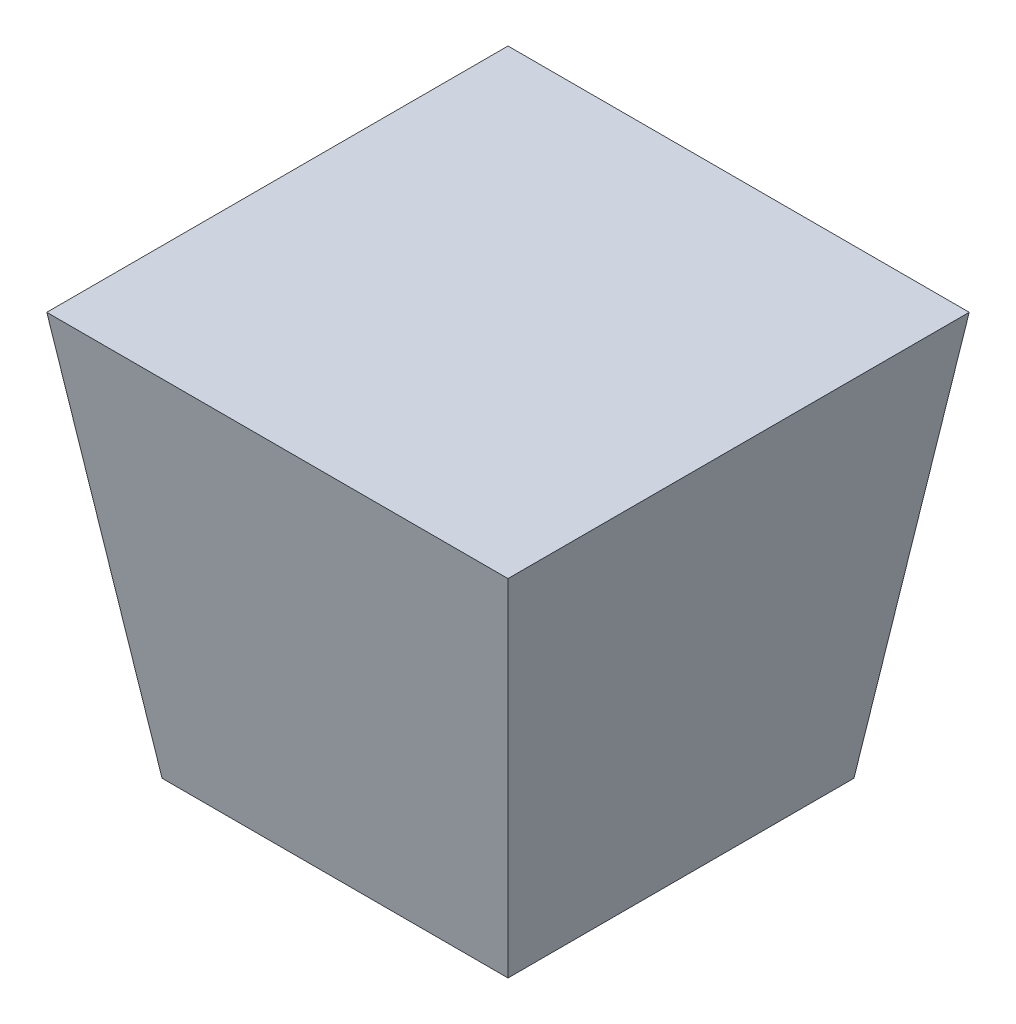
ISO-10303-21;
HEADER;
FILE_DESCRIPTION(('STEP AP214'),'2;1');
FILE_NAME('part.step','',(''),(''),'','','');
FILE_SCHEMA(('AUTOMOTIVE_DESIGN { 1 0 10303 214 1 1 1 1 }'));
ENDSEC;
DATA;
#1=APPLICATION_CONTEXT('core data for automotive mechanical design processes');
#2=APPLICATION_PROTOCOL_DEFINITION('international standard','automotive_design',2000,#1);
#3=PRODUCT_CONTEXT('',#1,'mechanical');
#4=PRODUCT('Part','Part','',(#3));
#5=PRODUCT_RELATED_PRODUCT_CATEGORY('part','',(#4));
#6=PRODUCT_DEFINITION_FORMATION('','',#4);
#7=PRODUCT_DEFINITION_CONTEXT('part definition',#1,'design');
#8=PRODUCT_DEFINITION('design','',#6,#7);
#9=PRODUCT_DEFINITION_SHAPE('','',#8);
#10=(LENGTH_UNIT() NAMED_UNIT(*) SI_UNIT(.MILLI.,.METRE.));
#11=(NAMED_UNIT(*) PLANE_ANGLE_UNIT() SI_UNIT($,.RADIAN.));
#12=(NAMED_UNIT(*) SI_UNIT($,.STERADIAN.) SOLID_ANGLE_UNIT());
#13=UNCERTAINTY_MEASURE_WITH_UNIT(LENGTH_MEASURE(1.E-05),#10,'distance_accuracy_value','');
#14=(GEOMETRIC_REPRESENTATION_CONTEXT(3) GLOBAL_UNCERTAINTY_ASSIGNED_CONTEXT((#13)) GLOBAL_UNIT_ASSIGNED_CONTEXT((#10,
#11,#12)) REPRESENTATION_CONTEXT('',''));
#15=CARTESIAN_POINT('',(0.,0.,0.));
#16=DIRECTION('',(0.,0.,1.));
#17=DIRECTION('',(1.,0.,0.));
#18=AXIS2_PLACEMENT_3D('',#15,#16,#17);
#19=CARTESIAN_POINT('',(-50.8077994428969,40.,-15.5431754874652));
#20=DIRECTION('',(1.,0.,0.));
#21=DIRECTION('',(0.,0.,-1.));
#22=AXIS2_PLACEMENT_3D('',#19,#20,#21);
#23=PLANE('',#22);
#24=DIRECTION('',(0.,0.,1.));
#25=VECTOR('',#24,1.);
#26=CARTESIAN_POINT('',(-50.8077994428969,0.,-15.5431754874652));
#27=LINE('',#26,#25);
#28=CARTESIAN_POINT('',(-50.8077994428969,0.,-15.5431754874652));
#29=VERTEX_POINT('',#28);
#30=CARTESIAN_POINT('',(-50.8077994428969,0.,14.4568245125348));
#31=VERTEX_POINT('',#30);
#32=EDGE_CURVE('E94',#29,#31,#27,.T.);
#33=ORIENTED_EDGE('',*,*,#32,.T.);
#34=DIRECTION('',(0.,-0.970142500145332,-0.242535625036333));
#35=VECTOR('',#34,1.);
#36=CARTESIAN_POINT('',(-50.8077994428969,0.,14.4568245125348));
#37=LINE('',#36,#35);
#38=CARTESIAN_POINT('',(-50.8077994428969,40.,24.4568245125348));
#39=VERTEX_POINT('',#38);
#40=EDGE_CURVE('E105',#39,#31,#37,.T.);
#41=ORIENTED_EDGE('',*,*,#40,.F.);
#42=DIRECTION('',(0.,0.,1.));
#43=VECTOR('',#42,1.);
#44=CARTESIAN_POINT('',(-50.8077994428969,40.,-15.5431754874652));
#45=LINE('',#44,#43);
#46=CARTESIAN_POINT('',(-50.8077994428969,40.,-15.5431754874652));
#47=VERTEX_POINT('',#46);
#48=EDGE_CURVE('E87',#47,#39,#45,.T.);
#49=ORIENTED_EDGE('',*,*,#48,.F.);
#50=DIRECTION('',(0.,-1.,0.));
#51=VECTOR('',#50,1.);
#52=CARTESIAN_POINT('',(-50.8077994428969,40.,-15.5431754874652));
#53=LINE('',#52,#51);
#54=EDGE_CURVE('E42',#47,#29,#53,.T.);
#55=ORIENTED_EDGE('',*,*,#54,.T.);
#56=EDGE_LOOP('',(#33,#41,#49,#55));
#57=FACE_BOUND('',#56,.T.);
#58=ADVANCED_FACE('F35',(#57),#23,.F.);
#59=CARTESIAN_POINT('',(-50.8077994428969,40.,-15.5431754874652));
#60=DIRECTION('',(0.,0.,1.));
#61=DIRECTION('',(1.,0.,0.));
#62=AXIS2_PLACEMENT_3D('',#59,#60,#61);
#63=PLANE('',#62);
#64=DIRECTION('',(-1.,0.,0.));
#65=VECTOR('',#64,1.);
#66=CARTESIAN_POINT('',(-50.8077994428969,40.,-15.5431754874652));
#67=LINE('',#66,#65);
#68=CARTESIAN_POINT('',(-10.8077994428969,40.,-15.5431754874652));
#69=VERTEX_POINT('',#68);
#70=EDGE_CURVE('E57',#69,#47,#67,.T.);
#71=ORIENTED_EDGE('',*,*,#70,.F.);
#72=DIRECTION('',(0.242535625036333,0.970142500145332,0.));
#73=VECTOR('',#72,1.);
#74=CARTESIAN_POINT('',(-20.8077994428969,0.,-15.5431754874652));
#75=LINE('',#74,#73);
#76=CARTESIAN_POINT('',(-20.8077994428969,0.,-15.5431754874652));
#77=VERTEX_POINT('',#76);
#78=EDGE_CURVE('E83',#77,#69,#75,.T.);
#79=ORIENTED_EDGE('',*,*,#78,.F.);
#80=DIRECTION('',(-1.,0.,0.));
#81=VECTOR('',#80,1.);
#82=CARTESIAN_POINT('',(-50.8077994428969,0.,-15.5431754874652));
#83=LINE('',#82,#81);
#84=EDGE_CURVE('E89',#77,#29,#83,.T.);
#85=ORIENTED_EDGE('',*,*,#84,.T.);
#86=ORIENTED_EDGE('',*,*,#54,.F.);
#87=EDGE_LOOP('',(#71,#79,#85,#86));
#88=FACE_BOUND('',#87,.T.);
#89=ADVANCED_FACE('F109',(#88),#63,.F.);
#90=CARTESIAN_POINT('',(0.,40.,0.));
#91=DIRECTION('',(0.,1.,0.));
#92=DIRECTION('',(0.,0.,1.));
#93=AXIS2_PLACEMENT_3D('',#90,#91,#92);
#94=PLANE('',#93);
#95=ORIENTED_EDGE('',*,*,#48,.T.);
#96=DIRECTION('',(1.,0.,0.));
#97=VECTOR('',#96,1.);
#98=CARTESIAN_POINT('',(-50.8077994428969,40.,24.4568245125348));
#99=LINE('',#98,#97);
#100=CARTESIAN_POINT('',(-10.8077994428969,40.,24.4568245125348));
#101=VERTEX_POINT('',#100);
#102=EDGE_CURVE('E76',#39,#101,#99,.T.);
#103=ORIENTED_EDGE('',*,*,#102,.T.);
#104=DIRECTION('',(0.,0.,-1.));
#105=VECTOR('',#104,1.);
#106=CARTESIAN_POINT('',(-10.8077994428969,40.,-15.5431754874652));
#107=LINE('',#106,#105);
#108=EDGE_CURVE('E80',#101,#69,#107,.T.);
#109=ORIENTED_EDGE('',*,*,#108,.T.);
#110=ORIENTED_EDGE('',*,*,#70,.T.);
#111=EDGE_LOOP('',(#95,#103,#109,#110));
#112=FACE_BOUND('',#111,.T.);
#113=ADVANCED_FACE('F85',(#112),#94,.T.);
#114=CARTESIAN_POINT('',(0.,0.,0.));
#115=DIRECTION('',(0.,1.,0.));
#116=DIRECTION('',(0.,0.,1.));
#117=AXIS2_PLACEMENT_3D('',#114,#115,#116);
#118=PLANE('',#117);
#119=DIRECTION('',(0.,0.,-1.));
#120=VECTOR('',#119,1.);
#121=CARTESIAN_POINT('',(-20.8077994428969,0.,24.4568245125348));
#122=LINE('',#121,#120);
#123=CARTESIAN_POINT('',(-20.8077994428969,0.,14.4568245125348));
#124=VERTEX_POINT('',#123);
#125=EDGE_CURVE('E97',#124,#77,#122,.T.);
#126=ORIENTED_EDGE('',*,*,#125,.F.);
#127=DIRECTION('',(-1.,0.,0.));
#128=VECTOR('',#127,1.);
#129=CARTESIAN_POINT('',(-10.8077994428969,0.,14.4568245125348));
#130=LINE('',#129,#128);
#131=EDGE_CURVE('E49',#124,#31,#130,.T.);
#132=ORIENTED_EDGE('',*,*,#131,.T.);
#133=ORIENTED_EDGE('',*,*,#32,.F.);
#134=ORIENTED_EDGE('',*,*,#84,.F.);
#135=EDGE_LOOP('',(#126,#132,#133,#134));
#136=FACE_BOUND('',#135,.T.);
#137=ADVANCED_FACE('F104',(#136),#118,.F.);
#138=CARTESIAN_POINT('',(-20.8077994428969,0.,24.4568245125348));
#139=DIRECTION('',(-0.970142500145332,0.242535625036333,0.));
#140=DIRECTION('',(-0.242535625036333,-0.970142500145332,0.));
#141=AXIS2_PLACEMENT_3D('',#138,#139,#140);
#142=PLANE('',#141);
#143=ORIENTED_EDGE('',*,*,#108,.F.);
#144=DIRECTION('',(-0.235702260395516,-0.942809041582063,-0.235702260395516));
#145=VECTOR('',#144,1.);
#146=CARTESIAN_POINT('',(-20.2522438873414,2.22222222222222,15.0123800680904));
#147=LINE('',#146,#145);
#148=EDGE_CURVE('E11',#101,#124,#147,.T.);
#149=ORIENTED_EDGE('',*,*,#148,.T.);
#150=ORIENTED_EDGE('',*,*,#125,.T.);
#151=ORIENTED_EDGE('',*,*,#78,.T.);
#152=EDGE_LOOP('',(#143,#149,#150,#151));
#153=FACE_BOUND('',#152,.T.);
#154=ADVANCED_FACE('F81',(#153),#142,.F.);
#155=CARTESIAN_POINT('',(-10.8077994428969,0.,14.4568245125348));
#156=DIRECTION('',(0.,0.242535625036333,-0.970142500145332));
#157=DIRECTION('',(0.,0.970142500145332,0.242535625036333));
#158=AXIS2_PLACEMENT_3D('',#155,#156,#157);
#159=PLANE('',#158);
#160=ORIENTED_EDGE('',*,*,#102,.F.);
#161=ORIENTED_EDGE('',*,*,#40,.T.);
#162=ORIENTED_EDGE('',*,*,#131,.F.);
#163=ORIENTED_EDGE('',*,*,#148,.F.);
#164=EDGE_LOOP('',(#160,#161,#162,#163));
#165=FACE_BOUND('',#164,.T.);
#166=ADVANCED_FACE('F74',(#165),#159,.F.);
#167=CLOSED_SHELL('',(#58,#89,#113,#137,#154,#166));
#168=MANIFOLD_SOLID_BREP('B2',#167);
#169=ADVANCED_BREP_SHAPE_REPRESENTATION('',(#18,#168),#14);
#170=SHAPE_DEFINITION_REPRESENTATION(#9,#169);
ENDSEC;
END-ISO-10303-21;
